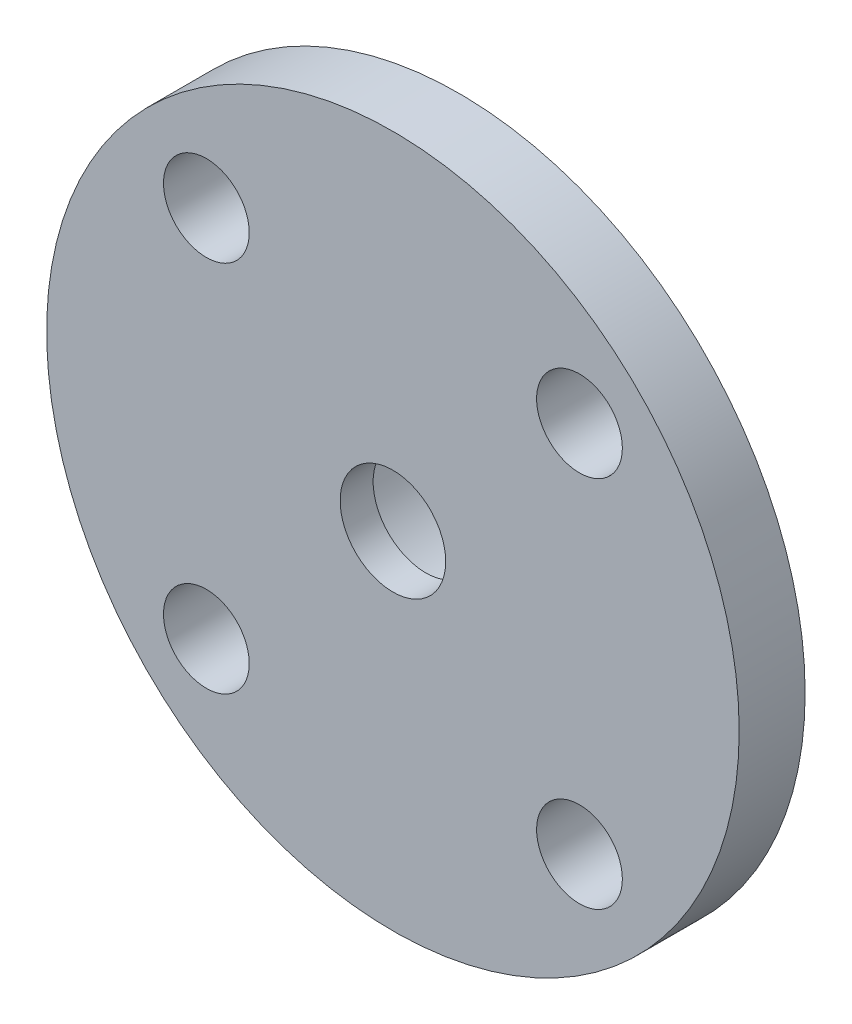
ISO-10303-21;
HEADER;
FILE_DESCRIPTION(('STEP AP214'),'2;1');
FILE_NAME('part.step','',(''),(''),'','','');
FILE_SCHEMA(('AUTOMOTIVE_DESIGN { 1 0 10303 214 1 1 1 1 }'));
ENDSEC;
DATA;
#1=APPLICATION_CONTEXT('core data for automotive mechanical design processes');
#2=APPLICATION_PROTOCOL_DEFINITION('international standard','automotive_design',2000,#1);
#3=PRODUCT_CONTEXT('',#1,'mechanical');
#4=PRODUCT('Part','Part','',(#3));
#5=PRODUCT_RELATED_PRODUCT_CATEGORY('part','',(#4));
#6=PRODUCT_DEFINITION_FORMATION('','',#4);
#7=PRODUCT_DEFINITION_CONTEXT('part definition',#1,'design');
#8=PRODUCT_DEFINITION('design','',#6,#7);
#9=PRODUCT_DEFINITION_SHAPE('','',#8);
#10=(LENGTH_UNIT() NAMED_UNIT(*) SI_UNIT(.MILLI.,.METRE.));
#11=(NAMED_UNIT(*) PLANE_ANGLE_UNIT() SI_UNIT($,.RADIAN.));
#12=(NAMED_UNIT(*) SI_UNIT($,.STERADIAN.) SOLID_ANGLE_UNIT());
#13=UNCERTAINTY_MEASURE_WITH_UNIT(LENGTH_MEASURE(1.E-05),#10,'distance_accuracy_value','');
#14=(GEOMETRIC_REPRESENTATION_CONTEXT(3) GLOBAL_UNCERTAINTY_ASSIGNED_CONTEXT((#13)) GLOBAL_UNIT_ASSIGNED_CONTEXT((#10,
#11,#12)) REPRESENTATION_CONTEXT('',''));
#15=CARTESIAN_POINT('',(0.,0.,0.));
#16=DIRECTION('',(0.,0.,1.));
#17=DIRECTION('',(1.,0.,0.));
#18=AXIS2_PLACEMENT_3D('',#15,#16,#17);
#19=CARTESIAN_POINT('',(0.,0.,0.));
#20=DIRECTION('',(0.,0.,1.));
#21=DIRECTION('',(1.,0.,0.));
#22=AXIS2_PLACEMENT_3D('',#19,#20,#21);
#23=CYLINDRICAL_SURFACE('',#22,3.2);
#24=CARTESIAN_POINT('',(0.,0.,-2.));
#25=DIRECTION('',(0.,0.,1.));
#26=DIRECTION('',(1.,0.,0.));
#27=AXIS2_PLACEMENT_3D('',#24,#25,#26);
#28=CIRCLE('',#27,3.2);
#29=CARTESIAN_POINT('',(3.2,0.,-2.));
#30=VERTEX_POINT('',#29);
#31=EDGE_CURVE('E61',#30,#30,#28,.T.);
#32=ORIENTED_EDGE('',*,*,#31,.F.);
#33=EDGE_LOOP('',(#32));
#34=FACE_BOUND('',#33,.T.);
#35=CARTESIAN_POINT('',(0.,0.,0.));
#36=DIRECTION('',(0.,0.,1.));
#37=DIRECTION('',(1.,0.,0.));
#38=AXIS2_PLACEMENT_3D('',#35,#36,#37);
#39=CIRCLE('',#38,3.2);
#40=CARTESIAN_POINT('',(3.2,0.,0.));
#41=VERTEX_POINT('',#40);
#42=EDGE_CURVE('E10',#41,#41,#39,.T.);
#43=ORIENTED_EDGE('',*,*,#42,.T.);
#44=EDGE_LOOP('',(#43));
#45=FACE_BOUND('',#44,.T.);
#46=ADVANCED_FACE('F33',(#34,#45),#23,.F.);
#47=CARTESIAN_POINT('',(-3.2,0.,0.));
#48=DIRECTION('',(0.,0.,-1.));
#49=DIRECTION('',(-1.,0.,0.));
#50=AXIS2_PLACEMENT_3D('',#47,#48,#49);
#51=PLANE('',#50);
#52=CARTESIAN_POINT('',(-11.3137084989848,11.3137084989847,0.));
#53=DIRECTION('',(0.,0.,1.));
#54=DIRECTION('',(0.,1.,0.));
#55=AXIS2_PLACEMENT_3D('',#52,#53,#54);
#56=CIRCLE('',#55,2.6);
#57=CARTESIAN_POINT('',(-11.3137084989848,13.9137084989847,0.));
#58=VERTEX_POINT('',#57);
#59=EDGE_CURVE('E81',#58,#58,#56,.T.);
#60=ORIENTED_EDGE('',*,*,#59,.F.);
#61=EDGE_LOOP('',(#60));
#62=FACE_BOUND('',#61,.T.);
#63=CARTESIAN_POINT('',(-11.3137084989848,-11.3137084989847,0.));
#64=DIRECTION('',(0.,0.,1.));
#65=DIRECTION('',(-1.,0.,0.));
#66=AXIS2_PLACEMENT_3D('',#63,#64,#65);
#67=CIRCLE('',#66,2.6);
#68=CARTESIAN_POINT('',(-13.9137084989848,-11.3137084989847,0.));
#69=VERTEX_POINT('',#68);
#70=EDGE_CURVE('E74',#69,#69,#67,.T.);
#71=ORIENTED_EDGE('',*,*,#70,.F.);
#72=EDGE_LOOP('',(#71));
#73=FACE_BOUND('',#72,.T.);
#74=CARTESIAN_POINT('',(11.3137084989849,-11.3137084989847,0.));
#75=DIRECTION('',(0.,0.,1.));
#76=DIRECTION('',(0.,-1.,0.));
#77=AXIS2_PLACEMENT_3D('',#74,#75,#76);
#78=CIRCLE('',#77,2.6);
#79=CARTESIAN_POINT('',(11.3137084989849,-13.9137084989847,0.));
#80=VERTEX_POINT('',#79);
#81=EDGE_CURVE('E75',#80,#80,#78,.T.);
#82=ORIENTED_EDGE('',*,*,#81,.F.);
#83=EDGE_LOOP('',(#82));
#84=FACE_BOUND('',#83,.T.);
#85=CARTESIAN_POINT('',(11.3137084989848,11.3137084989847,0.));
#86=DIRECTION('',(0.,0.,1.));
#87=DIRECTION('',(1.,0.,0.));
#88=AXIS2_PLACEMENT_3D('',#85,#86,#87);
#89=CIRCLE('',#88,2.6);
#90=CARTESIAN_POINT('',(13.9137084989848,11.3137084989847,0.));
#91=VERTEX_POINT('',#90);
#92=EDGE_CURVE('E67',#91,#91,#89,.T.);
#93=ORIENTED_EDGE('',*,*,#92,.F.);
#94=EDGE_LOOP('',(#93));
#95=FACE_BOUND('',#94,.T.);
#96=ORIENTED_EDGE('',*,*,#42,.F.);
#97=EDGE_LOOP('',(#96));
#98=FACE_BOUND('',#97,.T.);
#99=CARTESIAN_POINT('',(0.,0.,0.));
#100=DIRECTION('',(0.,0.,1.));
#101=DIRECTION('',(1.,0.,0.));
#102=AXIS2_PLACEMENT_3D('',#99,#100,#101);
#103=CIRCLE('',#102,21.);
#104=CARTESIAN_POINT('',(21.,0.,0.));
#105=VERTEX_POINT('',#104);
#106=EDGE_CURVE('E39',#105,#105,#103,.T.);
#107=ORIENTED_EDGE('',*,*,#106,.T.);
#108=EDGE_LOOP('',(#107));
#109=FACE_BOUND('',#108,.T.);
#110=ADVANCED_FACE('F91',(#62,#73,#84,#95,#98,#109),#51,.F.);
#111=CARTESIAN_POINT('',(0.,0.,0.));
#112=DIRECTION('',(0.,0.,1.));
#113=DIRECTION('',(1.,0.,0.));
#114=AXIS2_PLACEMENT_3D('',#111,#112,#113);
#115=CYLINDRICAL_SURFACE('',#114,21.);
#116=ORIENTED_EDGE('',*,*,#106,.F.);
#117=EDGE_LOOP('',(#116));
#118=FACE_BOUND('',#117,.T.);
#119=CARTESIAN_POINT('',(0.,0.,-4.));
#120=DIRECTION('',(0.,0.,1.));
#121=DIRECTION('',(1.,0.,0.));
#122=AXIS2_PLACEMENT_3D('',#119,#120,#121);
#123=CIRCLE('',#122,21.);
#124=CARTESIAN_POINT('',(21.,0.,-4.));
#125=VERTEX_POINT('',#124);
#126=EDGE_CURVE('E43',#125,#125,#123,.T.);
#127=ORIENTED_EDGE('',*,*,#126,.T.);
#128=EDGE_LOOP('',(#127));
#129=FACE_BOUND('',#128,.T.);
#130=ADVANCED_FACE('F94',(#118,#129),#115,.T.);
#131=CARTESIAN_POINT('',(-21.,0.,-4.));
#132=DIRECTION('',(0.,0.,1.));
#133=DIRECTION('',(1.,0.,0.));
#134=AXIS2_PLACEMENT_3D('',#131,#132,#133);
#135=PLANE('',#134);
#136=CARTESIAN_POINT('',(-11.3137084989848,11.3137084989847,-4.));
#137=DIRECTION('',(0.,0.,1.));
#138=DIRECTION('',(1.,0.,0.));
#139=AXIS2_PLACEMENT_3D('',#136,#137,#138);
#140=CIRCLE('',#139,2.6);
#141=CARTESIAN_POINT('',(-8.71370849898478,11.3137084989847,-4.));
#142=VERTEX_POINT('',#141);
#143=EDGE_CURVE('E70',#142,#142,#140,.F.);
#144=ORIENTED_EDGE('',*,*,#143,.F.);
#145=EDGE_LOOP('',(#144));
#146=FACE_BOUND('',#145,.T.);
#147=CARTESIAN_POINT('',(-11.3137084989848,-11.3137084989847,-4.));
#148=DIRECTION('',(0.,0.,1.));
#149=DIRECTION('',(1.,0.,0.));
#150=AXIS2_PLACEMENT_3D('',#147,#148,#149);
#151=CIRCLE('',#150,2.6);
#152=CARTESIAN_POINT('',(-8.71370849898478,-11.3137084989847,-4.));
#153=VERTEX_POINT('',#152);
#154=EDGE_CURVE('E78',#153,#153,#151,.F.);
#155=ORIENTED_EDGE('',*,*,#154,.F.);
#156=EDGE_LOOP('',(#155));
#157=FACE_BOUND('',#156,.T.);
#158=CARTESIAN_POINT('',(11.3137084989849,-11.3137084989847,-4.));
#159=DIRECTION('',(0.,0.,1.));
#160=DIRECTION('',(1.,0.,0.));
#161=AXIS2_PLACEMENT_3D('',#158,#159,#160);
#162=CIRCLE('',#161,2.6);
#163=CARTESIAN_POINT('',(13.9137084989849,-11.3137084989847,-4.));
#164=VERTEX_POINT('',#163);
#165=EDGE_CURVE('E71',#164,#164,#162,.F.);
#166=ORIENTED_EDGE('',*,*,#165,.F.);
#167=EDGE_LOOP('',(#166));
#168=FACE_BOUND('',#167,.T.);
#169=CARTESIAN_POINT('',(11.3137084989848,11.3137084989847,-4.));
#170=DIRECTION('',(0.,0.,1.));
#171=DIRECTION('',(1.,0.,0.));
#172=AXIS2_PLACEMENT_3D('',#169,#170,#171);
#173=CIRCLE('',#172,2.6);
#174=CARTESIAN_POINT('',(13.9137084989848,11.3137084989847,-4.));
#175=VERTEX_POINT('',#174);
#176=EDGE_CURVE('E64',#175,#175,#173,.F.);
#177=ORIENTED_EDGE('',*,*,#176,.F.);
#178=EDGE_LOOP('',(#177));
#179=FACE_BOUND('',#178,.T.);
#180=ORIENTED_EDGE('',*,*,#126,.F.);
#181=EDGE_LOOP('',(#180));
#182=FACE_BOUND('',#181,.T.);
#183=CARTESIAN_POINT('',(0.,0.,-4.));
#184=DIRECTION('',(0.,0.,1.));
#185=DIRECTION('',(1.,0.,0.));
#186=AXIS2_PLACEMENT_3D('',#183,#184,#185);
#187=CIRCLE('',#186,9.5);
#188=CARTESIAN_POINT('',(9.5,0.,-4.));
#189=VERTEX_POINT('',#188);
#190=EDGE_CURVE('E47',#189,#189,#187,.T.);
#191=ORIENTED_EDGE('',*,*,#190,.T.);
#192=EDGE_LOOP('',(#191));
#193=FACE_BOUND('',#192,.T.);
#194=ADVANCED_FACE('F135',(#146,#157,#168,#179,#182,#193),#135,.F.);
#195=CARTESIAN_POINT('',(0.,0.,0.));
#196=DIRECTION('',(0.,0.,1.));
#197=DIRECTION('',(1.,0.,0.));
#198=AXIS2_PLACEMENT_3D('',#195,#196,#197);
#199=CYLINDRICAL_SURFACE('',#198,9.5);
#200=ORIENTED_EDGE('',*,*,#190,.F.);
#201=EDGE_LOOP('',(#200));
#202=FACE_BOUND('',#201,.T.);
#203=CARTESIAN_POINT('',(0.,0.,-7.8));
#204=DIRECTION('',(0.,0.,1.));
#205=DIRECTION('',(1.,0.,0.));
#206=AXIS2_PLACEMENT_3D('',#203,#204,#205);
#207=CIRCLE('',#206,9.5);
#208=CARTESIAN_POINT('',(9.5,0.,-7.8));
#209=VERTEX_POINT('',#208);
#210=EDGE_CURVE('E52',#209,#209,#207,.T.);
#211=ORIENTED_EDGE('',*,*,#210,.T.);
#212=EDGE_LOOP('',(#211));
#213=FACE_BOUND('',#212,.T.);
#214=ADVANCED_FACE('F143',(#202,#213),#199,.T.);
#215=CARTESIAN_POINT('',(-9.5,0.,-7.8));
#216=DIRECTION('',(0.,0.,1.));
#217=DIRECTION('',(1.,0.,0.));
#218=AXIS2_PLACEMENT_3D('',#215,#216,#217);
#219=PLANE('',#218);
#220=ORIENTED_EDGE('',*,*,#210,.F.);
#221=EDGE_LOOP('',(#220));
#222=FACE_BOUND('',#221,.T.);
#223=CARTESIAN_POINT('',(0.,0.,-7.8));
#224=DIRECTION('',(0.,0.,1.));
#225=DIRECTION('',(1.,0.,0.));
#226=AXIS2_PLACEMENT_3D('',#223,#224,#225);
#227=CIRCLE('',#226,6.);
#228=CARTESIAN_POINT('',(6.,0.,-7.8));
#229=VERTEX_POINT('',#228);
#230=EDGE_CURVE('E55',#229,#229,#227,.T.);
#231=ORIENTED_EDGE('',*,*,#230,.T.);
#232=EDGE_LOOP('',(#231));
#233=FACE_BOUND('',#232,.T.);
#234=ADVANCED_FACE('F151',(#222,#233),#219,.F.);
#235=CARTESIAN_POINT('',(0.,0.,0.));
#236=DIRECTION('',(0.,0.,1.));
#237=DIRECTION('',(1.,0.,0.));
#238=AXIS2_PLACEMENT_3D('',#235,#236,#237);
#239=CYLINDRICAL_SURFACE('',#238,6.);
#240=ORIENTED_EDGE('',*,*,#230,.F.);
#241=EDGE_LOOP('',(#240));
#242=FACE_BOUND('',#241,.T.);
#243=CARTESIAN_POINT('',(0.,0.,-2.));
#244=DIRECTION('',(0.,0.,1.));
#245=DIRECTION('',(1.,0.,0.));
#246=AXIS2_PLACEMENT_3D('',#243,#244,#245);
#247=CIRCLE('',#246,6.);
#248=CARTESIAN_POINT('',(6.,0.,-2.));
#249=VERTEX_POINT('',#248);
#250=EDGE_CURVE('E58',#249,#249,#247,.T.);
#251=ORIENTED_EDGE('',*,*,#250,.T.);
#252=EDGE_LOOP('',(#251));
#253=FACE_BOUND('',#252,.T.);
#254=ADVANCED_FACE('F115',(#242,#253),#239,.F.);
#255=CARTESIAN_POINT('',(-6.,0.,-2.));
#256=DIRECTION('',(0.,0.,1.));
#257=DIRECTION('',(1.,0.,0.));
#258=AXIS2_PLACEMENT_3D('',#255,#256,#257);
#259=PLANE('',#258);
#260=ORIENTED_EDGE('',*,*,#250,.F.);
#261=EDGE_LOOP('',(#260));
#262=FACE_BOUND('',#261,.T.);
#263=ORIENTED_EDGE('',*,*,#31,.T.);
#264=EDGE_LOOP('',(#263));
#265=FACE_BOUND('',#264,.T.);
#266=ADVANCED_FACE('F105',(#262,#265),#259,.F.);
#267=CARTESIAN_POINT('',(11.3137084989848,11.3137084989847,-11.3539105243401));
#268=DIRECTION('',(0.,0.,1.));
#269=DIRECTION('',(1.,0.,0.));
#270=AXIS2_PLACEMENT_3D('',#267,#268,#269);
#271=CYLINDRICAL_SURFACE('',#270,2.6);
#272=ORIENTED_EDGE('',*,*,#176,.T.);
#273=EDGE_LOOP('',(#272));
#274=FACE_BOUND('',#273,.T.);
#275=ORIENTED_EDGE('',*,*,#92,.T.);
#276=EDGE_LOOP('',(#275));
#277=FACE_BOUND('',#276,.T.);
#278=ADVANCED_FACE('F102',(#274,#277),#271,.F.);
#279=CARTESIAN_POINT('',(11.3137084989849,-11.3137084989847,-11.3539105243401));
#280=DIRECTION('',(0.,0.,1.));
#281=DIRECTION('',(1.,0.,0.));
#282=AXIS2_PLACEMENT_3D('',#279,#280,#281);
#283=CYLINDRICAL_SURFACE('',#282,2.6);
#284=ORIENTED_EDGE('',*,*,#165,.T.);
#285=EDGE_LOOP('',(#284));
#286=FACE_BOUND('',#285,.T.);
#287=ORIENTED_EDGE('',*,*,#81,.T.);
#288=EDGE_LOOP('',(#287));
#289=FACE_BOUND('',#288,.T.);
#290=ADVANCED_FACE('F104',(#286,#289),#283,.F.);
#291=CARTESIAN_POINT('',(-11.3137084989848,-11.3137084989847,-11.3539105243401));
#292=DIRECTION('',(0.,0.,1.));
#293=DIRECTION('',(1.,0.,0.));
#294=AXIS2_PLACEMENT_3D('',#291,#292,#293);
#295=CYLINDRICAL_SURFACE('',#294,2.6);
#296=ORIENTED_EDGE('',*,*,#154,.T.);
#297=EDGE_LOOP('',(#296));
#298=FACE_BOUND('',#297,.T.);
#299=ORIENTED_EDGE('',*,*,#70,.T.);
#300=EDGE_LOOP('',(#299));
#301=FACE_BOUND('',#300,.T.);
#302=ADVANCED_FACE('F112',(#298,#301),#295,.F.);
#303=CARTESIAN_POINT('',(-11.3137084989848,11.3137084989847,-11.3539105243401));
#304=DIRECTION('',(0.,0.,1.));
#305=DIRECTION('',(1.,0.,0.));
#306=AXIS2_PLACEMENT_3D('',#303,#304,#305);
#307=CYLINDRICAL_SURFACE('',#306,2.6);
#308=ORIENTED_EDGE('',*,*,#143,.T.);
#309=EDGE_LOOP('',(#308));
#310=FACE_BOUND('',#309,.T.);
#311=ORIENTED_EDGE('',*,*,#59,.T.);
#312=EDGE_LOOP('',(#311));
#313=FACE_BOUND('',#312,.T.);
#314=ADVANCED_FACE('F89',(#310,#313),#307,.F.);
#315=CLOSED_SHELL('',(#46,#110,#130,#194,#214,#234,#254,#266,#278,#290,#302,#314));
#316=MANIFOLD_SOLID_BREP('B2',#315);
#317=ADVANCED_BREP_SHAPE_REPRESENTATION('',(#18,#316),#14);
#318=SHAPE_DEFINITION_REPRESENTATION(#9,#317);
ENDSEC;
END-ISO-10303-21;
